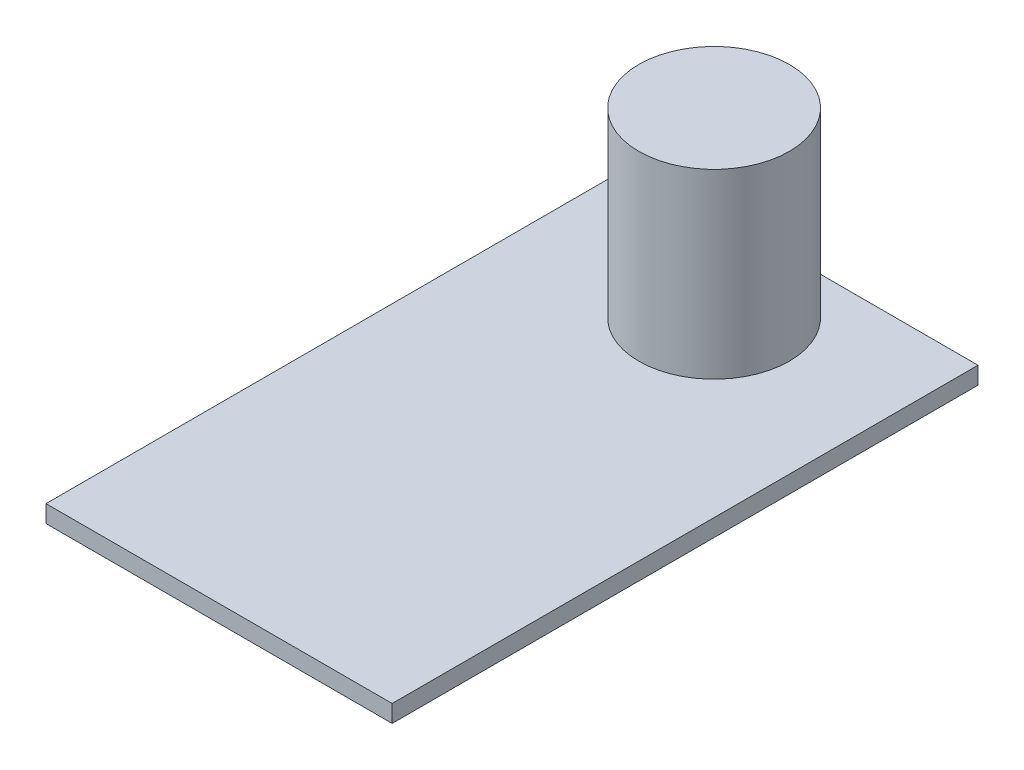
ISO-10303-21;
HEADER;
FILE_DESCRIPTION(('STEP AP214'),'2;1');
FILE_NAME('part.step','',(''),(''),'','','');
FILE_SCHEMA(('AUTOMOTIVE_DESIGN { 1 0 10303 214 1 1 1 1 }'));
ENDSEC;
DATA;
#1=APPLICATION_CONTEXT('core data for automotive mechanical design processes');
#2=APPLICATION_PROTOCOL_DEFINITION('international standard','automotive_design',2000,#1);
#3=PRODUCT_CONTEXT('',#1,'mechanical');
#4=PRODUCT('Part','Part','',(#3));
#5=PRODUCT_RELATED_PRODUCT_CATEGORY('part','',(#4));
#6=PRODUCT_DEFINITION_FORMATION('','',#4);
#7=PRODUCT_DEFINITION_CONTEXT('part definition',#1,'design');
#8=PRODUCT_DEFINITION('design','',#6,#7);
#9=PRODUCT_DEFINITION_SHAPE('','',#8);
#10=(LENGTH_UNIT() NAMED_UNIT(*) SI_UNIT(.MILLI.,.METRE.));
#11=(NAMED_UNIT(*) PLANE_ANGLE_UNIT() SI_UNIT($,.RADIAN.));
#12=(NAMED_UNIT(*) SI_UNIT($,.STERADIAN.) SOLID_ANGLE_UNIT());
#13=UNCERTAINTY_MEASURE_WITH_UNIT(LENGTH_MEASURE(1.E-05),#10,'distance_accuracy_value','');
#14=(GEOMETRIC_REPRESENTATION_CONTEXT(3) GLOBAL_UNCERTAINTY_ASSIGNED_CONTEXT((#13)) GLOBAL_UNIT_ASSIGNED_CONTEXT((#10,
#11,#12)) REPRESENTATION_CONTEXT('',''));
#15=CARTESIAN_POINT('',(0.,0.,0.));
#16=DIRECTION('',(0.,0.,1.));
#17=DIRECTION('',(1.,0.,0.));
#18=AXIS2_PLACEMENT_3D('',#15,#16,#17);
#19=CARTESIAN_POINT('',(0.,2.,0.));
#20=DIRECTION('',(0.,1.,0.));
#21=DIRECTION('',(0.,0.,1.));
#22=AXIS2_PLACEMENT_3D('',#19,#20,#21);
#23=PLANE('',#22);
#24=DIRECTION('',(0.,0.,1.));
#25=VECTOR('',#24,1.);
#26=CARTESIAN_POINT('',(-40.,2.,-67.7));
#27=LINE('',#26,#25);
#28=CARTESIAN_POINT('',(-40.,2.,-67.7));
#29=VERTEX_POINT('',#28);
#30=CARTESIAN_POINT('',(-40.,2.,0.));
#31=VERTEX_POINT('',#30);
#32=EDGE_CURVE('E94',#29,#31,#27,.T.);
#33=ORIENTED_EDGE('',*,*,#32,.T.);
#34=DIRECTION('',(1.,0.,0.));
#35=VECTOR('',#34,1.);
#36=CARTESIAN_POINT('',(-40.,2.,0.));
#37=LINE('',#36,#35);
#38=CARTESIAN_POINT('',(0.,2.,0.));
#39=VERTEX_POINT('',#38);
#40=EDGE_CURVE('E89',#31,#39,#37,.T.);
#41=ORIENTED_EDGE('',*,*,#40,.T.);
#42=DIRECTION('',(0.,0.,-1.));
#43=VECTOR('',#42,1.);
#44=CARTESIAN_POINT('',(0.,2.,-67.7));
#45=LINE('',#44,#43);
#46=CARTESIAN_POINT('',(0.,2.,-67.7));
#47=VERTEX_POINT('',#46);
#48=EDGE_CURVE('E92',#39,#47,#45,.T.);
#49=ORIENTED_EDGE('',*,*,#48,.T.);
#50=DIRECTION('',(-1.,0.,0.));
#51=VECTOR('',#50,1.);
#52=CARTESIAN_POINT('',(-40.,2.,-67.7));
#53=LINE('',#52,#51);
#54=EDGE_CURVE('E59',#47,#29,#53,.T.);
#55=ORIENTED_EDGE('',*,*,#54,.T.);
#56=EDGE_LOOP('',(#33,#41,#49,#55));
#57=FACE_BOUND('',#56,.T.);
#58=CARTESIAN_POINT('',(-20.,2.,-57.2));
#59=DIRECTION('',(0.,1.,0.));
#60=DIRECTION('',(0.,0.,1.));
#61=AXIS2_PLACEMENT_3D('',#58,#59,#60);
#62=CIRCLE('',#61,8.7);
#63=CARTESIAN_POINT('',(-20.,2.,-65.9));
#64=VERTEX_POINT('',#63);
#65=EDGE_CURVE('E131',#64,#64,#62,.T.);
#66=ORIENTED_EDGE('',*,*,#65,.F.);
#67=EDGE_LOOP('',(#66));
#68=FACE_BOUND('',#67,.T.);
#69=ADVANCED_FACE('F41',(#57,#68),#23,.T.);
#70=CARTESIAN_POINT('',(-40.,2.,-67.7));
#71=DIRECTION('',(1.,0.,0.));
#72=DIRECTION('',(0.,0.,-1.));
#73=AXIS2_PLACEMENT_3D('',#70,#71,#72);
#74=PLANE('',#73);
#75=DIRECTION('',(0.,0.,1.));
#76=VECTOR('',#75,1.);
#77=CARTESIAN_POINT('',(-40.,0.,-67.7));
#78=LINE('',#77,#76);
#79=CARTESIAN_POINT('',(-40.,0.,-67.7));
#80=VERTEX_POINT('',#79);
#81=CARTESIAN_POINT('',(-40.,0.,0.));
#82=VERTEX_POINT('',#81);
#83=EDGE_CURVE('E110',#80,#82,#78,.T.);
#84=ORIENTED_EDGE('',*,*,#83,.T.);
#85=DIRECTION('',(0.,-1.,0.));
#86=VECTOR('',#85,1.);
#87=CARTESIAN_POINT('',(-40.,2.,0.));
#88=LINE('',#87,#86);
#89=EDGE_CURVE('E11',#31,#82,#88,.T.);
#90=ORIENTED_EDGE('',*,*,#89,.F.);
#91=ORIENTED_EDGE('',*,*,#32,.F.);
#92=DIRECTION('',(0.,-1.,0.));
#93=VECTOR('',#92,1.);
#94=CARTESIAN_POINT('',(-40.,2.,-67.7));
#95=LINE('',#94,#93);
#96=EDGE_CURVE('E106',#29,#80,#95,.T.);
#97=ORIENTED_EDGE('',*,*,#96,.T.);
#98=EDGE_LOOP('',(#84,#90,#91,#97));
#99=FACE_BOUND('',#98,.T.);
#100=ADVANCED_FACE('F43',(#99),#74,.F.);
#101=CARTESIAN_POINT('',(-40.,2.,0.));
#102=DIRECTION('',(0.,0.,-1.));
#103=DIRECTION('',(-1.,0.,0.));
#104=AXIS2_PLACEMENT_3D('',#101,#102,#103);
#105=PLANE('',#104);
#106=DIRECTION('',(1.,0.,0.));
#107=VECTOR('',#106,1.);
#108=CARTESIAN_POINT('',(-40.,0.,0.));
#109=LINE('',#108,#107);
#110=CARTESIAN_POINT('',(0.,0.,0.));
#111=VERTEX_POINT('',#110);
#112=EDGE_CURVE('E99',#82,#111,#109,.T.);
#113=ORIENTED_EDGE('',*,*,#112,.T.);
#114=DIRECTION('',(0.,-1.,0.));
#115=VECTOR('',#114,1.);
#116=CARTESIAN_POINT('',(0.,2.,0.));
#117=LINE('',#116,#115);
#118=EDGE_CURVE('E51',#39,#111,#117,.T.);
#119=ORIENTED_EDGE('',*,*,#118,.F.);
#120=ORIENTED_EDGE('',*,*,#40,.F.);
#121=ORIENTED_EDGE('',*,*,#89,.T.);
#122=EDGE_LOOP('',(#113,#119,#120,#121));
#123=FACE_BOUND('',#122,.T.);
#124=ADVANCED_FACE('F98',(#123),#105,.F.);
#125=CARTESIAN_POINT('',(0.,2.,-67.7));
#126=DIRECTION('',(-1.,0.,0.));
#127=DIRECTION('',(0.,0.,1.));
#128=AXIS2_PLACEMENT_3D('',#125,#126,#127);
#129=PLANE('',#128);
#130=DIRECTION('',(0.,0.,-1.));
#131=VECTOR('',#130,1.);
#132=CARTESIAN_POINT('',(0.,0.,-67.7));
#133=LINE('',#132,#131);
#134=CARTESIAN_POINT('',(0.,0.,-67.7));
#135=VERTEX_POINT('',#134);
#136=EDGE_CURVE('E76',#111,#135,#133,.T.);
#137=ORIENTED_EDGE('',*,*,#136,.T.);
#138=DIRECTION('',(0.,-1.,0.));
#139=VECTOR('',#138,1.);
#140=CARTESIAN_POINT('',(0.,2.,-67.7));
#141=LINE('',#140,#139);
#142=EDGE_CURVE('E101',#47,#135,#141,.T.);
#143=ORIENTED_EDGE('',*,*,#142,.F.);
#144=ORIENTED_EDGE('',*,*,#48,.F.);
#145=ORIENTED_EDGE('',*,*,#118,.T.);
#146=EDGE_LOOP('',(#137,#143,#144,#145));
#147=FACE_BOUND('',#146,.T.);
#148=ADVANCED_FACE('F102',(#147),#129,.F.);
#149=CARTESIAN_POINT('',(-40.,2.,-67.7));
#150=DIRECTION('',(0.,0.,1.));
#151=DIRECTION('',(1.,0.,0.));
#152=AXIS2_PLACEMENT_3D('',#149,#150,#151);
#153=PLANE('',#152);
#154=DIRECTION('',(-1.,0.,0.));
#155=VECTOR('',#154,1.);
#156=CARTESIAN_POINT('',(-40.,0.,-67.7));
#157=LINE('',#156,#155);
#158=EDGE_CURVE('E82',#135,#80,#157,.T.);
#159=ORIENTED_EDGE('',*,*,#158,.T.);
#160=ORIENTED_EDGE('',*,*,#96,.F.);
#161=ORIENTED_EDGE('',*,*,#54,.F.);
#162=ORIENTED_EDGE('',*,*,#142,.T.);
#163=EDGE_LOOP('',(#159,#160,#161,#162));
#164=FACE_BOUND('',#163,.T.);
#165=ADVANCED_FACE('F124',(#164),#153,.F.);
#166=CARTESIAN_POINT('',(0.,0.,0.));
#167=DIRECTION('',(0.,1.,0.));
#168=DIRECTION('',(0.,0.,1.));
#169=AXIS2_PLACEMENT_3D('',#166,#167,#168);
#170=PLANE('',#169);
#171=ORIENTED_EDGE('',*,*,#83,.F.);
#172=ORIENTED_EDGE('',*,*,#158,.F.);
#173=ORIENTED_EDGE('',*,*,#136,.F.);
#174=ORIENTED_EDGE('',*,*,#112,.F.);
#175=EDGE_LOOP('',(#171,#172,#173,#174));
#176=FACE_BOUND('',#175,.T.);
#177=ADVANCED_FACE('F127',(#176),#170,.F.);
#178=CARTESIAN_POINT('',(-20.,23.,-57.2));
#179=DIRECTION('',(0.,-1.,0.));
#180=DIRECTION('',(0.,0.,-1.));
#181=AXIS2_PLACEMENT_3D('',#178,#179,#180);
#182=CYLINDRICAL_SURFACE('',#181,8.7);
#183=CARTESIAN_POINT('',(-20.,23.,-57.2));
#184=DIRECTION('',(0.,1.,0.));
#185=DIRECTION('',(0.,0.,1.));
#186=AXIS2_PLACEMENT_3D('',#183,#184,#185);
#187=CIRCLE('',#186,8.7);
#188=CARTESIAN_POINT('',(-20.,23.,-65.9));
#189=VERTEX_POINT('',#188);
#190=EDGE_CURVE('E114',#189,#189,#187,.T.);
#191=CARTESIAN_POINT('',(-20.,23.,-65.9));
#192=CARTESIAN_POINT('',(-20.,22.78125,-65.9));
#193=CARTESIAN_POINT('',(-20.,22.5625,-65.9));
#194=CARTESIAN_POINT('',(-20.,22.125,-65.9));
#195=CARTESIAN_POINT('',(-20.,21.90625,-65.9));
#196=CARTESIAN_POINT('',(-20.,21.46875,-65.9));
#197=CARTESIAN_POINT('',(-20.,21.25,-65.9));
#198=CARTESIAN_POINT('',(-20.,20.8125,-65.9));
#199=CARTESIAN_POINT('',(-20.,20.59375,-65.9));
#200=CARTESIAN_POINT('',(-20.,20.15625,-65.9));
#201=CARTESIAN_POINT('',(-20.,19.9375,-65.9));
#202=CARTESIAN_POINT('',(-20.,19.5,-65.9));
#203=CARTESIAN_POINT('',(-20.,19.28125,-65.9));
#204=CARTESIAN_POINT('',(-20.,18.84375,-65.9));
#205=CARTESIAN_POINT('',(-20.,18.625,-65.9));
#206=CARTESIAN_POINT('',(-20.,18.1875,-65.9));
#207=CARTESIAN_POINT('',(-20.,17.96875,-65.9));
#208=CARTESIAN_POINT('',(-20.,17.53125,-65.9));
#209=CARTESIAN_POINT('',(-20.,17.3125,-65.9));
#210=CARTESIAN_POINT('',(-20.,16.875,-65.9));
#211=CARTESIAN_POINT('',(-20.,16.65625,-65.9));
#212=CARTESIAN_POINT('',(-20.,16.21875,-65.9));
#213=CARTESIAN_POINT('',(-20.,16.,-65.9));
#214=CARTESIAN_POINT('',(-20.,15.5625,-65.9));
#215=CARTESIAN_POINT('',(-20.,15.34375,-65.9));
#216=CARTESIAN_POINT('',(-20.,14.90625,-65.9));
#217=CARTESIAN_POINT('',(-20.,14.6875,-65.9));
#218=CARTESIAN_POINT('',(-20.,14.25,-65.9));
#219=CARTESIAN_POINT('',(-20.,14.03125,-65.9));
#220=CARTESIAN_POINT('',(-20.,13.59375,-65.9));
#221=CARTESIAN_POINT('',(-20.,13.375,-65.9));
#222=CARTESIAN_POINT('',(-20.,12.9375,-65.9));
#223=CARTESIAN_POINT('',(-20.,12.71875,-65.9));
#224=CARTESIAN_POINT('',(-20.,12.28125,-65.9));
#225=CARTESIAN_POINT('',(-20.,12.0625,-65.9));
#226=CARTESIAN_POINT('',(-20.,11.625,-65.9));
#227=CARTESIAN_POINT('',(-20.,11.40625,-65.9));
#228=CARTESIAN_POINT('',(-20.,10.96875,-65.9));
#229=CARTESIAN_POINT('',(-20.,10.75,-65.9));
#230=CARTESIAN_POINT('',(-20.,10.3125,-65.9));
#231=CARTESIAN_POINT('',(-20.,10.09375,-65.9));
#232=CARTESIAN_POINT('',(-20.,9.65625,-65.9));
#233=CARTESIAN_POINT('',(-20.,9.4375,-65.9));
#234=CARTESIAN_POINT('',(-20.,9.,-65.9));
#235=CARTESIAN_POINT('',(-20.,8.78125,-65.9));
#236=CARTESIAN_POINT('',(-20.,8.34375,-65.9));
#237=CARTESIAN_POINT('',(-20.,8.125,-65.9));
#238=CARTESIAN_POINT('',(-20.,7.6875,-65.9));
#239=CARTESIAN_POINT('',(-20.,7.46875,-65.9));
#240=CARTESIAN_POINT('',(-20.,7.03125,-65.9));
#241=CARTESIAN_POINT('',(-20.,6.8125,-65.9));
#242=CARTESIAN_POINT('',(-20.,6.375,-65.9));
#243=CARTESIAN_POINT('',(-20.,6.15625,-65.9));
#244=CARTESIAN_POINT('',(-20.,5.71875,-65.9));
#245=CARTESIAN_POINT('',(-20.,5.5,-65.9));
#246=CARTESIAN_POINT('',(-20.,5.0625,-65.9));
#247=CARTESIAN_POINT('',(-20.,4.84375,-65.9));
#248=CARTESIAN_POINT('',(-20.,4.40625,-65.9));
#249=CARTESIAN_POINT('',(-20.,4.1875,-65.9));
#250=CARTESIAN_POINT('',(-20.,3.75,-65.9));
#251=CARTESIAN_POINT('',(-20.,3.53125,-65.9));
#252=CARTESIAN_POINT('',(-20.,3.09375,-65.9));
#253=CARTESIAN_POINT('',(-20.,2.875,-65.9));
#254=CARTESIAN_POINT('',(-20.,2.4375,-65.9));
#255=CARTESIAN_POINT('',(-20.,2.21875,-65.9));
#256=CARTESIAN_POINT('',(-20.,2.,-65.9));
#257=B_SPLINE_CURVE_WITH_KNOTS('',3,(#191,#192,#193,#194,#195,#196,#197,#198,#199,#200,#201,
#202,#203,#204,#205,#206,#207,#208,#209,#210,#211,#212,#213,#214,#215,#216,#217,#218,#219,#220,
#221,#222,#223,#224,#225,#226,#227,#228,#229,#230,#231,#232,#233,#234,#235,#236,#237,#238,#239,
#240,#241,#242,#243,#244,#245,#246,#247,#248,#249,#250,#251,#252,#253,#254,#255,#256),
.UNSPECIFIED.,.F.,.F.,(4,2,2,2,2,2,2,2,2,2,2,2,2,2,2,2,2,2,2,2,2,2,2,2,2,2,2,2,2,2,2,2,4),(0.,
0.656250000000001,1.3125,1.96875,2.625,3.28125,3.9375,4.59375,5.25,5.90625,6.5625,7.21875,7.875,
8.53125,9.1875,9.84375,10.5,11.15625,11.8125,12.46875,13.125,13.78125,14.4375,15.09375,15.75,
16.40625,17.0625,17.71875,18.375,19.03125,19.6875,20.34375,21.),.UNSPECIFIED.);
#258=EDGE_CURVE('BSEAM141',#189,#64,#257,.T.);
#259=ORIENTED_EDGE('',*,*,#190,.F.);
#260=ORIENTED_EDGE('',*,*,#65,.T.);
#261=ORIENTED_EDGE('',*,*,#258,.T.);
#262=ORIENTED_EDGE('',*,*,#258,.F.);
#263=EDGE_LOOP('',(#259,#261,#260,#262));
#264=FACE_BOUND('',#263,.T.);
#265=ADVANCED_FACE('F141',(#264),#182,.T.);
#266=CARTESIAN_POINT('',(-20.,23.,-57.2));
#267=DIRECTION('',(0.,1.,0.));
#268=DIRECTION('',(0.,0.,1.));
#269=AXIS2_PLACEMENT_3D('',#266,#267,#268);
#270=PLANE('',#269);
#271=ORIENTED_EDGE('',*,*,#190,.T.);
#272=EDGE_LOOP('',(#271));
#273=FACE_BOUND('',#272,.T.);
#274=ADVANCED_FACE('F139',(#273),#270,.T.);
#275=CLOSED_SHELL('',(#69,#100,#124,#148,#165,#177,#265,#274));
#276=MANIFOLD_SOLID_BREP('B2',#275);
#277=ADVANCED_BREP_SHAPE_REPRESENTATION('',(#18,#276),#14);
#278=SHAPE_DEFINITION_REPRESENTATION(#9,#277);
ENDSEC;
END-ISO-10303-21;
